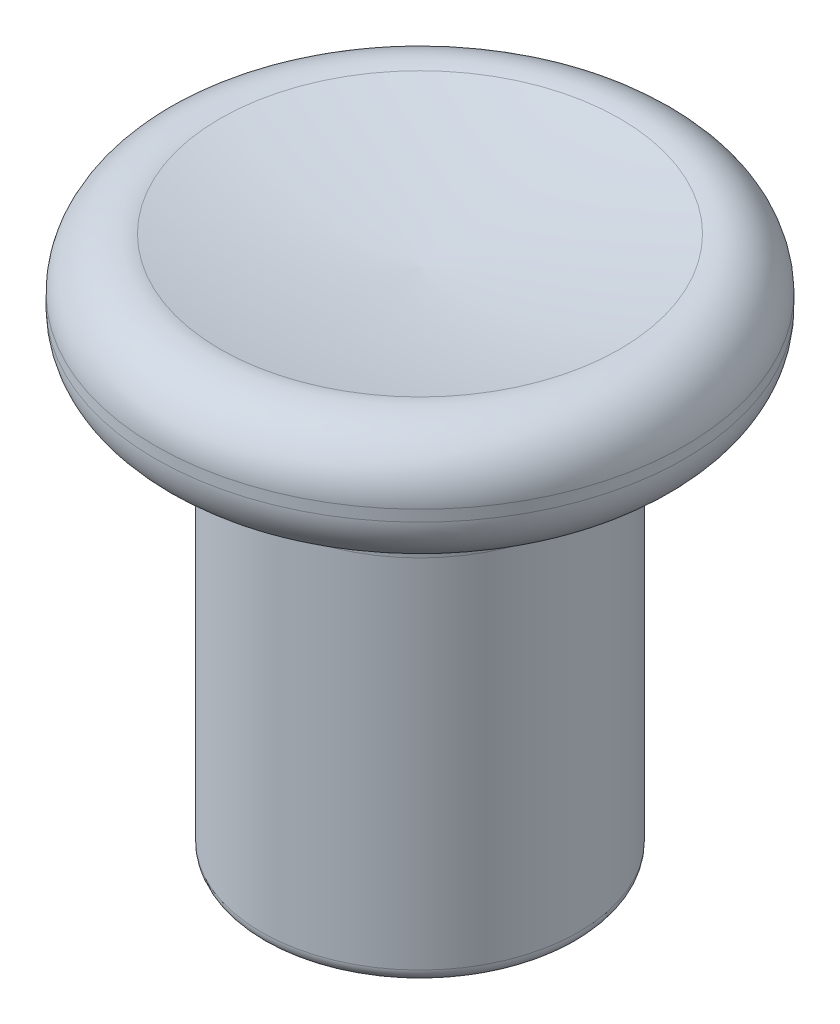
ISO-10303-21;
HEADER;
FILE_DESCRIPTION(('STEP AP214'),'2;1');
FILE_NAME('part.step','',(''),(''),'','','');
FILE_SCHEMA(('AUTOMOTIVE_DESIGN { 1 0 10303 214 1 1 1 1 }'));
ENDSEC;
DATA;
#1=APPLICATION_CONTEXT('core data for automotive mechanical design processes');
#2=APPLICATION_PROTOCOL_DEFINITION('international standard','automotive_design',2000,#1);
#3=PRODUCT_CONTEXT('',#1,'mechanical');
#4=PRODUCT('Part','Part','',(#3));
#5=PRODUCT_RELATED_PRODUCT_CATEGORY('part','',(#4));
#6=PRODUCT_DEFINITION_FORMATION('','',#4);
#7=PRODUCT_DEFINITION_CONTEXT('part definition',#1,'design');
#8=PRODUCT_DEFINITION('design','',#6,#7);
#9=PRODUCT_DEFINITION_SHAPE('','',#8);
#10=(LENGTH_UNIT() NAMED_UNIT(*) SI_UNIT(.MILLI.,.METRE.));
#11=(NAMED_UNIT(*) PLANE_ANGLE_UNIT() SI_UNIT($,.RADIAN.));
#12=(NAMED_UNIT(*) SI_UNIT($,.STERADIAN.) SOLID_ANGLE_UNIT());
#13=UNCERTAINTY_MEASURE_WITH_UNIT(LENGTH_MEASURE(1.E-05),#10,'distance_accuracy_value','');
#14=(GEOMETRIC_REPRESENTATION_CONTEXT(3) GLOBAL_UNCERTAINTY_ASSIGNED_CONTEXT((#13)) GLOBAL_UNIT_ASSIGNED_CONTEXT((#10,
#11,#12)) REPRESENTATION_CONTEXT('',''));
#15=CARTESIAN_POINT('',(0.,0.,0.));
#16=DIRECTION('',(0.,0.,1.));
#17=DIRECTION('',(1.,0.,0.));
#18=AXIS2_PLACEMENT_3D('',#15,#16,#17);
#19=CARTESIAN_POINT('',(0.,0.,0.));
#20=DIRECTION('',(0.,1.,0.));
#21=DIRECTION('',(0.,0.,1.));
#22=AXIS2_PLACEMENT_3D('',#19,#20,#21);
#23=PLANE('',#22);
#24=CARTESIAN_POINT('',(0.,0.,0.));
#25=DIRECTION('',(0.,1.,0.));
#26=DIRECTION('',(0.,0.,1.));
#27=AXIS2_PLACEMENT_3D('',#24,#25,#26);
#28=CIRCLE('',#27,5.);
#29=CARTESIAN_POINT('',(0.,0.,5.));
#30=VERTEX_POINT('',#29);
#31=EDGE_CURVE('E93',#30,#30,#28,.T.);
#32=ORIENTED_EDGE('',*,*,#31,.T.);
#33=EDGE_LOOP('',(#32));
#34=FACE_BOUND('',#33,.T.);
#35=CARTESIAN_POINT('',(0.,0.,0.));
#36=DIRECTION('',(0.,1.,0.));
#37=DIRECTION('',(0.,0.,1.));
#38=AXIS2_PLACEMENT_3D('',#35,#36,#37);
#39=CIRCLE('',#38,5.5);
#40=CARTESIAN_POINT('',(0.,0.,5.5));
#41=VERTEX_POINT('',#40);
#42=EDGE_CURVE('E94',#41,#41,#39,.F.);
#43=ORIENTED_EDGE('',*,*,#42,.T.);
#44=EDGE_LOOP('',(#43));
#45=FACE_BOUND('',#44,.T.);
#46=ADVANCED_FACE('F33',(#34,#45),#23,.F.);
#47=CARTESIAN_POINT('',(0.,16.,0.));
#48=DIRECTION('',(0.,-1.,0.));
#49=DIRECTION('',(0.,0.,-1.));
#50=AXIS2_PLACEMENT_3D('',#47,#48,#49);
#51=CYLINDRICAL_SURFACE('',#50,6.);
#52=CARTESIAN_POINT('',(0.,0.5,0.));
#53=DIRECTION('',(0.,1.,0.));
#54=DIRECTION('',(0.,0.,1.));
#55=AXIS2_PLACEMENT_3D('',#52,#53,#54);
#56=CIRCLE('',#55,6.);
#57=CARTESIAN_POINT('',(0.,0.5,6.));
#58=VERTEX_POINT('',#57);
#59=EDGE_CURVE('E11',#58,#58,#56,.T.);
#60=ORIENTED_EDGE('',*,*,#59,.T.);
#61=EDGE_LOOP('',(#60));
#62=FACE_BOUND('',#61,.T.);
#63=CARTESIAN_POINT('',(0.,14.,0.));
#64=DIRECTION('',(0.,1.,0.));
#65=DIRECTION('',(0.,0.,1.));
#66=AXIS2_PLACEMENT_3D('',#63,#64,#65);
#67=CIRCLE('',#66,6.);
#68=CARTESIAN_POINT('',(0.,14.,6.));
#69=VERTEX_POINT('',#68);
#70=EDGE_CURVE('E97',#69,#69,#67,.F.);
#71=ORIENTED_EDGE('',*,*,#70,.T.);
#72=EDGE_LOOP('',(#71));
#73=FACE_BOUND('',#72,.T.);
#74=ADVANCED_FACE('F63',(#62,#73),#51,.T.);
#75=CARTESIAN_POINT('',(0.,16.,0.));
#76=DIRECTION('',(0.,-1.,0.));
#77=DIRECTION('',(0.,0.,-1.));
#78=AXIS2_PLACEMENT_3D('',#75,#76,#77);
#79=CYLINDRICAL_SURFACE('',#78,4.5);
#80=CARTESIAN_POINT('',(0.,0.5,0.));
#81=DIRECTION('',(0.,1.,0.));
#82=DIRECTION('',(0.,0.,1.));
#83=AXIS2_PLACEMENT_3D('',#80,#81,#82);
#84=CIRCLE('',#83,4.5);
#85=CARTESIAN_POINT('',(0.,0.5,4.5));
#86=VERTEX_POINT('',#85);
#87=EDGE_CURVE('E40',#86,#86,#84,.F.);
#88=ORIENTED_EDGE('',*,*,#87,.T.);
#89=EDGE_LOOP('',(#88));
#90=FACE_BOUND('',#89,.T.);
#91=CARTESIAN_POINT('',(0.,16.,0.));
#92=DIRECTION('',(0.,1.,0.));
#93=DIRECTION('',(0.,0.,1.));
#94=AXIS2_PLACEMENT_3D('',#91,#92,#93);
#95=CIRCLE('',#94,4.5);
#96=CARTESIAN_POINT('',(0.,16.,4.5));
#97=VERTEX_POINT('',#96);
#98=EDGE_CURVE('E103',#97,#97,#95,.T.);
#99=ORIENTED_EDGE('',*,*,#98,.T.);
#100=EDGE_LOOP('',(#99));
#101=FACE_BOUND('',#100,.T.);
#102=ADVANCED_FACE('F69',(#90,#101),#79,.F.);
#103=CARTESIAN_POINT('',(0.,16.,0.));
#104=DIRECTION('',(0.,1.,0.));
#105=DIRECTION('',(0.,0.,1.));
#106=AXIS2_PLACEMENT_3D('',#103,#104,#105);
#107=PLANE('',#106);
#108=ORIENTED_EDGE('',*,*,#98,.F.);
#109=EDGE_LOOP('',(#108));
#110=FACE_BOUND('',#109,.T.);
#111=ADVANCED_FACE('F56',(#110),#107,.F.);
#112=CARTESIAN_POINT('',(0.,21.,0.));
#113=DIRECTION('',(0.,-1.,0.));
#114=DIRECTION('',(0.,0.,-1.));
#115=AXIS2_PLACEMENT_3D('',#112,#113,#114);
#116=CYLINDRICAL_SURFACE('',#115,10.);
#117=CARTESIAN_POINT('',(0.,18.4232468247088,0.));
#118=DIRECTION('',(0.,-1.,0.));
#119=DIRECTION('',(0.,0.,-1.));
#120=AXIS2_PLACEMENT_3D('',#117,#118,#119);
#121=CIRCLE('',#120,10.);
#122=CARTESIAN_POINT('',(0.,18.4232468247088,-10.));
#123=VERTEX_POINT('',#122);
#124=EDGE_CURVE('E106',#123,#123,#121,.T.);
#125=ORIENTED_EDGE('',*,*,#124,.T.);
#126=EDGE_LOOP('',(#125));
#127=FACE_BOUND('',#126,.T.);
#128=CARTESIAN_POINT('',(0.,18.,0.));
#129=DIRECTION('',(0.,1.,0.));
#130=DIRECTION('',(0.,0.,1.));
#131=AXIS2_PLACEMENT_3D('',#128,#129,#130);
#132=CIRCLE('',#131,10.);
#133=CARTESIAN_POINT('',(0.,18.,10.));
#134=VERTEX_POINT('',#133);
#135=EDGE_CURVE('E109',#134,#134,#132,.T.);
#136=ORIENTED_EDGE('',*,*,#135,.T.);
#137=EDGE_LOOP('',(#136));
#138=FACE_BOUND('',#137,.T.);
#139=ADVANCED_FACE('F46',(#127,#138),#116,.T.);
#140=CARTESIAN_POINT('',(0.,21.,10.));
#141=CARTESIAN_POINT('',(0.,19.5961393716268,5.09032943760784));
#142=CARTESIAN_POINT('',(0.,19.3162891437513,0.));
#143=B_SPLINE_CURVE_WITH_KNOTS('',2,(#140,#141,#142),.UNSPECIFIED.,.F.,.F.,(3,3),(0.,1.),.UNSPECIFIED.);
#144=CARTESIAN_POINT('',(0.,21.,0.));
#145=DIRECTION('',(0.,1.,0.));
#146=AXIS1_PLACEMENT('',#144,#145);
#147=SURFACE_OF_REVOLUTION('',#143,#146);
#148=CARTESIAN_POINT('',(0.,20.373557368566,0.));
#149=DIRECTION('',(0.,1.,0.));
#150=DIRECTION('',(0.,0.,1.));
#151=AXIS2_PLACEMENT_3D('',#148,#149,#150);
#152=CIRCLE('',#151,7.55695510101201);
#153=CARTESIAN_POINT('',(0.,20.373557368566,7.55695510101201));
#154=VERTEX_POINT('',#153);
#155=EDGE_CURVE('E112',#154,#154,#152,.T.);
#156=ORIENTED_EDGE('',*,*,#155,.T.);
#157=EDGE_LOOP('',(#156));
#158=FACE_BOUND('',#157,.T.);
#159=CARTESIAN_POINT('',(0.,19.3162891437513,0.));
#160=VERTEX_POINT('',#159);
#161=VERTEX_LOOP('',#160);
#162=FACE_BOUND('',#161,.T.);
#163=ADVANCED_FACE('F43',(#158,#162),#147,.T.);
#164=CARTESIAN_POINT('',(0.,18.4232468247088,0.));
#165=DIRECTION('',(0.,-1.,0.));
#166=DIRECTION('',(0.,0.,-1.));
#167=AXIS2_PLACEMENT_3D('',#164,#165,#166);
#168=TOROIDAL_SURFACE('',#167,8.,2.);
#169=ORIENTED_EDGE('',*,*,#124,.F.);
#170=EDGE_LOOP('',(#169));
#171=FACE_BOUND('',#170,.T.);
#172=ORIENTED_EDGE('',*,*,#155,.F.);
#173=EDGE_LOOP('',(#172));
#174=FACE_BOUND('',#173,.T.);
#175=ADVANCED_FACE('F45',(#171,#174),#168,.T.);
#176=CARTESIAN_POINT('',(0.,14.,0.));
#177=DIRECTION('',(0.,1.,0.));
#178=DIRECTION('',(0.,0.,1.));
#179=AXIS2_PLACEMENT_3D('',#176,#177,#178);
#180=TOROIDAL_SURFACE('',#179,8.,2.);
#181=ORIENTED_EDGE('',*,*,#70,.F.);
#182=EDGE_LOOP('',(#181));
#183=FACE_BOUND('',#182,.T.);
#184=CARTESIAN_POINT('',(0.,16.,0.));
#185=DIRECTION('',(0.,1.,0.));
#186=DIRECTION('',(0.,0.,1.));
#187=AXIS2_PLACEMENT_3D('',#184,#185,#186);
#188=CIRCLE('',#187,8.);
#189=CARTESIAN_POINT('',(0.,16.,8.));
#190=VERTEX_POINT('',#189);
#191=EDGE_CURVE('E100',#190,#190,#188,.T.);
#192=ORIENTED_EDGE('',*,*,#191,.F.);
#193=EDGE_LOOP('',(#192));
#194=FACE_BOUND('',#193,.T.);
#195=ADVANCED_FACE('F53',(#183,#194),#180,.F.);
#196=CARTESIAN_POINT('',(0.,18.,0.));
#197=DIRECTION('',(0.,1.,0.));
#198=DIRECTION('',(0.,0.,1.));
#199=AXIS2_PLACEMENT_3D('',#196,#197,#198);
#200=TOROIDAL_SURFACE('',#199,8.,2.);
#201=ORIENTED_EDGE('',*,*,#191,.T.);
#202=EDGE_LOOP('',(#201));
#203=FACE_BOUND('',#202,.T.);
#204=ORIENTED_EDGE('',*,*,#135,.F.);
#205=EDGE_LOOP('',(#204));
#206=FACE_BOUND('',#205,.T.);
#207=ADVANCED_FACE('F76',(#203,#206),#200,.T.);
#208=CARTESIAN_POINT('',(0.,0.5,0.));
#209=DIRECTION('',(0.,1.,0.));
#210=DIRECTION('',(0.,0.,1.));
#211=AXIS2_PLACEMENT_3D('',#208,#209,#210);
#212=TOROIDAL_SURFACE('',#211,5.,0.5);
#213=ORIENTED_EDGE('',*,*,#87,.F.);
#214=EDGE_LOOP('',(#213));
#215=FACE_BOUND('',#214,.T.);
#216=ORIENTED_EDGE('',*,*,#31,.F.);
#217=EDGE_LOOP('',(#216));
#218=FACE_BOUND('',#217,.T.);
#219=ADVANCED_FACE('F79',(#215,#218),#212,.T.);
#220=CARTESIAN_POINT('',(0.,0.5,0.));
#221=DIRECTION('',(0.,1.,0.));
#222=DIRECTION('',(0.,0.,1.));
#223=AXIS2_PLACEMENT_3D('',#220,#221,#222);
#224=TOROIDAL_SURFACE('',#223,5.5,0.5);
#225=ORIENTED_EDGE('',*,*,#42,.F.);
#226=EDGE_LOOP('',(#225));
#227=FACE_BOUND('',#226,.T.);
#228=ORIENTED_EDGE('',*,*,#59,.F.);
#229=EDGE_LOOP('',(#228));
#230=FACE_BOUND('',#229,.T.);
#231=ADVANCED_FACE('F35',(#227,#230),#224,.T.);
#232=CLOSED_SHELL('',(#46,#74,#102,#111,#139,#163,#175,#195,#207,#219,#231));
#233=MANIFOLD_SOLID_BREP('B2',#232);
#234=ADVANCED_BREP_SHAPE_REPRESENTATION('',(#18,#233),#14);
#235=SHAPE_DEFINITION_REPRESENTATION(#9,#234);
ENDSEC;
END-ISO-10303-21;
